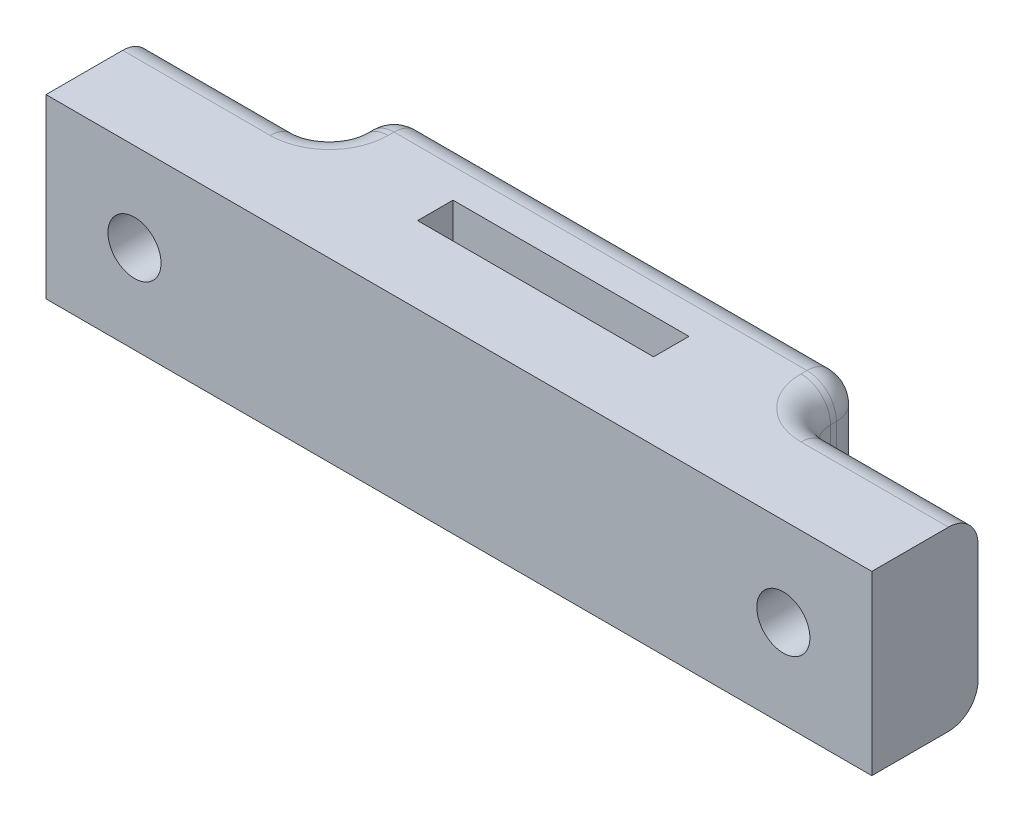
ISO-10303-21;
HEADER;
FILE_DESCRIPTION(('STEP AP214'),'2;1');
FILE_NAME('part.step','',(''),(''),'','','');
FILE_SCHEMA(('AUTOMOTIVE_DESIGN { 1 0 10303 214 1 1 1 1 }'));
ENDSEC;
DATA;
#1=APPLICATION_CONTEXT('core data for automotive mechanical design processes');
#2=APPLICATION_PROTOCOL_DEFINITION('international standard','automotive_design',2000,#1);
#3=PRODUCT_CONTEXT('',#1,'mechanical');
#4=PRODUCT('Part','Part','',(#3));
#5=PRODUCT_RELATED_PRODUCT_CATEGORY('part','',(#4));
#6=PRODUCT_DEFINITION_FORMATION('','',#4);
#7=PRODUCT_DEFINITION_CONTEXT('part definition',#1,'design');
#8=PRODUCT_DEFINITION('design','',#6,#7);
#9=PRODUCT_DEFINITION_SHAPE('','',#8);
#10=(LENGTH_UNIT() NAMED_UNIT(*) SI_UNIT(.MILLI.,.METRE.));
#11=(NAMED_UNIT(*) PLANE_ANGLE_UNIT() SI_UNIT($,.RADIAN.));
#12=(NAMED_UNIT(*) SI_UNIT($,.STERADIAN.) SOLID_ANGLE_UNIT());
#13=UNCERTAINTY_MEASURE_WITH_UNIT(LENGTH_MEASURE(1.E-05),#10,'distance_accuracy_value','');
#14=(GEOMETRIC_REPRESENTATION_CONTEXT(3) GLOBAL_UNCERTAINTY_ASSIGNED_CONTEXT((#13)) GLOBAL_UNIT_ASSIGNED_CONTEXT((#10,
#11,#12)) REPRESENTATION_CONTEXT('',''));
#15=CARTESIAN_POINT('',(0.,0.,0.));
#16=DIRECTION('',(0.,0.,1.));
#17=DIRECTION('',(1.,0.,0.));
#18=AXIS2_PLACEMENT_3D('',#15,#16,#17);
#19=CARTESIAN_POINT('',(20.,15.,-0.999999999999992));
#20=DIRECTION('',(0.,0.,1.));
#21=DIRECTION('',(1.,0.,0.));
#22=AXIS2_PLACEMENT_3D('',#19,#20,#21);
#23=PLANE('',#22);
#24=DIRECTION('',(0.,-1.,0.));
#25=VECTOR('',#24,1.);
#26=CARTESIAN_POINT('',(35.,15.,-0.999999999999992));
#27=LINE('',#26,#25);
#28=CARTESIAN_POINT('',(35.,12.5,-0.999999999999992));
#29=VERTEX_POINT('',#28);
#30=CARTESIAN_POINT('',(35.,2.5,-0.999999999999992));
#31=VERTEX_POINT('',#30);
#32=EDGE_CURVE('E252',#29,#31,#27,.T.);
#33=ORIENTED_EDGE('',*,*,#32,.T.);
#34=DIRECTION('',(-1.,0.,0.));
#35=VECTOR('',#34,1.);
#36=CARTESIAN_POINT('',(20.,2.5,-0.999999999999992));
#37=LINE('',#36,#35);
#38=CARTESIAN_POINT('',(22.5,2.5,-0.999999999999992));
#39=VERTEX_POINT('',#38);
#40=EDGE_CURVE('E325',#31,#39,#37,.T.);
#41=ORIENTED_EDGE('',*,*,#40,.T.);
#42=DIRECTION('',(0.,-1.,0.));
#43=VECTOR('',#42,1.);
#44=CARTESIAN_POINT('',(22.5,15.,-0.999999999999992));
#45=LINE('',#44,#43);
#46=CARTESIAN_POINT('',(22.5,12.5,-0.999999999999992));
#47=VERTEX_POINT('',#46);
#48=EDGE_CURVE('E321',#39,#47,#45,.F.);
#49=ORIENTED_EDGE('',*,*,#48,.T.);
#50=DIRECTION('',(-1.,0.,0.));
#51=VECTOR('',#50,1.);
#52=CARTESIAN_POINT('',(20.,12.5,-0.999999999999992));
#53=LINE('',#52,#51);
#54=EDGE_CURVE('E323',#47,#29,#53,.F.);
#55=ORIENTED_EDGE('',*,*,#54,.T.);
#56=EDGE_LOOP('',(#33,#41,#49,#55));
#57=FACE_BOUND('',#56,.T.);
#58=CARTESIAN_POINT('',(27.5,7.5,-0.999999999999992));
#59=DIRECTION('',(0.,0.,-1.));
#60=DIRECTION('',(-1.,0.,0.));
#61=AXIS2_PLACEMENT_3D('',#58,#59,#60);
#62=CIRCLE('',#61,4.);
#63=CARTESIAN_POINT('',(23.5,7.5,-0.999999999999992));
#64=VERTEX_POINT('',#63);
#65=EDGE_CURVE('E413',#64,#64,#62,.T.);
#66=ORIENTED_EDGE('',*,*,#65,.F.);
#67=EDGE_LOOP('',(#66));
#68=FACE_BOUND('',#67,.T.);
#69=ADVANCED_FACE('F35',(#57,#68),#23,.F.);
#70=CARTESIAN_POINT('',(-35.,15.,-0.999999999999992));
#71=DIRECTION('',(0.,0.,1.));
#72=DIRECTION('',(1.,0.,0.));
#73=AXIS2_PLACEMENT_3D('',#70,#71,#72);
#74=PLANE('',#73);
#75=DIRECTION('',(0.,-1.,0.));
#76=VECTOR('',#75,1.);
#77=CARTESIAN_POINT('',(-35.,15.,-0.999999999999992));
#78=LINE('',#77,#76);
#79=CARTESIAN_POINT('',(-35.,12.5,-0.999999999999992));
#80=VERTEX_POINT('',#79);
#81=CARTESIAN_POINT('',(-35.,2.5,-0.999999999999992));
#82=VERTEX_POINT('',#81);
#83=EDGE_CURVE('E266',#80,#82,#78,.T.);
#84=ORIENTED_EDGE('',*,*,#83,.F.);
#85=DIRECTION('',(-1.,0.,0.));
#86=VECTOR('',#85,1.);
#87=CARTESIAN_POINT('',(-35.,12.5,-0.999999999999992));
#88=LINE('',#87,#86);
#89=CARTESIAN_POINT('',(-22.5,12.5,-0.999999999999992));
#90=VERTEX_POINT('',#89);
#91=EDGE_CURVE('E294',#80,#90,#88,.F.);
#92=ORIENTED_EDGE('',*,*,#91,.T.);
#93=DIRECTION('',(0.,-1.,0.));
#94=VECTOR('',#93,1.);
#95=CARTESIAN_POINT('',(-22.5,0.,-0.999999999999992));
#96=LINE('',#95,#94);
#97=CARTESIAN_POINT('',(-22.5,2.5,-0.999999999999992));
#98=VERTEX_POINT('',#97);
#99=EDGE_CURVE('E290',#90,#98,#96,.T.);
#100=ORIENTED_EDGE('',*,*,#99,.T.);
#101=DIRECTION('',(-1.,0.,0.));
#102=VECTOR('',#101,1.);
#103=CARTESIAN_POINT('',(-35.,2.5,-0.999999999999992));
#104=LINE('',#103,#102);
#105=EDGE_CURVE('E292',#98,#82,#104,.T.);
#106=ORIENTED_EDGE('',*,*,#105,.T.);
#107=EDGE_LOOP('',(#84,#92,#100,#106));
#108=FACE_BOUND('',#107,.T.);
#109=CARTESIAN_POINT('',(-27.5,7.5,-0.999999999999992));
#110=DIRECTION('',(0.,0.,-1.));
#111=DIRECTION('',(-1.,0.,0.));
#112=AXIS2_PLACEMENT_3D('',#109,#110,#111);
#113=CIRCLE('',#112,3.99999999999999);
#114=CARTESIAN_POINT('',(-31.5,7.5,-0.999999999999992));
#115=VERTEX_POINT('',#114);
#116=EDGE_CURVE('E431',#115,#115,#113,.T.);
#117=ORIENTED_EDGE('',*,*,#116,.F.);
#118=EDGE_LOOP('',(#117));
#119=FACE_BOUND('',#118,.T.);
#120=ADVANCED_FACE('F465',(#108,#119),#74,.F.);
#121=CARTESIAN_POINT('',(0.,15.,0.));
#122=DIRECTION('',(0.,-1.,0.));
#123=DIRECTION('',(0.,0.,-1.));
#124=AXIS2_PLACEMENT_3D('',#121,#122,#123);
#125=PLANE('',#124);
#126=CARTESIAN_POINT('',(-22.5,15.,-3.49999999999999));
#127=DIRECTION('',(0.,-1.,0.));
#128=DIRECTION('',(0.,0.,-1.));
#129=AXIS2_PLACEMENT_3D('',#126,#127,#128);
#130=CIRCLE('',#129,5.);
#131=CARTESIAN_POINT('',(-22.5,15.,1.50000000000001));
#132=VERTEX_POINT('',#131);
#133=CARTESIAN_POINT('',(-17.5,15.,-3.49999999999999));
#134=VERTEX_POINT('',#133);
#135=EDGE_CURVE('E280',#132,#134,#130,.F.);
#136=ORIENTED_EDGE('',*,*,#135,.F.);
#137=DIRECTION('',(-1.,0.,0.));
#138=VECTOR('',#137,1.);
#139=CARTESIAN_POINT('',(0.,15.,1.50000000000001));
#140=LINE('',#139,#138);
#141=CARTESIAN_POINT('',(-35.,15.,1.50000000000001));
#142=VERTEX_POINT('',#141);
#143=EDGE_CURVE('E283',#132,#142,#140,.T.);
#144=ORIENTED_EDGE('',*,*,#143,.T.);
#145=DIRECTION('',(0.,0.,1.));
#146=VECTOR('',#145,1.);
#147=CARTESIAN_POINT('',(-35.,15.,8.00000000000001));
#148=LINE('',#147,#146);
#149=CARTESIAN_POINT('',(-35.,15.,8.00000000000001));
#150=VERTEX_POINT('',#149);
#151=EDGE_CURVE('E244',#142,#150,#148,.T.);
#152=ORIENTED_EDGE('',*,*,#151,.T.);
#153=DIRECTION('',(1.,0.,0.));
#154=VECTOR('',#153,1.);
#155=CARTESIAN_POINT('',(35.,15.,8.00000000000001));
#156=LINE('',#155,#154);
#157=CARTESIAN_POINT('',(35.,15.,8.00000000000001));
#158=VERTEX_POINT('',#157);
#159=EDGE_CURVE('E246',#150,#158,#156,.T.);
#160=ORIENTED_EDGE('',*,*,#159,.T.);
#161=DIRECTION('',(0.,0.,-1.));
#162=VECTOR('',#161,1.);
#163=CARTESIAN_POINT('',(35.,15.,-0.999999999999992));
#164=LINE('',#163,#162);
#165=CARTESIAN_POINT('',(35.,15.,1.50000000000001));
#166=VERTEX_POINT('',#165);
#167=EDGE_CURVE('E249',#158,#166,#164,.T.);
#168=ORIENTED_EDGE('',*,*,#167,.T.);
#169=DIRECTION('',(-1.,0.,0.));
#170=VECTOR('',#169,1.);
#171=CARTESIAN_POINT('',(0.,15.,1.50000000000001));
#172=LINE('',#171,#170);
#173=CARTESIAN_POINT('',(22.5,15.,1.50000000000001));
#174=VERTEX_POINT('',#173);
#175=EDGE_CURVE('E278',#166,#174,#172,.T.);
#176=ORIENTED_EDGE('',*,*,#175,.T.);
#177=CARTESIAN_POINT('',(22.5,15.,-3.49999999999999));
#178=DIRECTION('',(0.,-1.,0.));
#179=DIRECTION('',(0.,0.,-1.));
#180=AXIS2_PLACEMENT_3D('',#177,#178,#179);
#181=CIRCLE('',#180,5.);
#182=CARTESIAN_POINT('',(17.5,15.,-3.49999999999999));
#183=VERTEX_POINT('',#182);
#184=EDGE_CURVE('E275',#183,#174,#181,.F.);
#185=ORIENTED_EDGE('',*,*,#184,.F.);
#186=DIRECTION('',(0.,0.,-1.));
#187=VECTOR('',#186,1.);
#188=CARTESIAN_POINT('',(17.5,15.,0.));
#189=LINE('',#188,#187);
#190=CARTESIAN_POINT('',(17.5,15.,-4.));
#191=VERTEX_POINT('',#190);
#192=EDGE_CURVE('E273',#183,#191,#189,.T.);
#193=ORIENTED_EDGE('',*,*,#192,.T.);
#194=DIRECTION('',(-1.,0.,0.));
#195=VECTOR('',#194,1.);
#196=CARTESIAN_POINT('',(0.,15.,-4.));
#197=LINE('',#196,#195);
#198=CARTESIAN_POINT('',(-17.5,15.,-4.));
#199=VERTEX_POINT('',#198);
#200=EDGE_CURVE('E269',#191,#199,#197,.T.);
#201=ORIENTED_EDGE('',*,*,#200,.T.);
#202=DIRECTION('',(0.,0.,1.));
#203=VECTOR('',#202,1.);
#204=CARTESIAN_POINT('',(-17.5,15.,0.));
#205=LINE('',#204,#203);
#206=EDGE_CURVE('E271',#199,#134,#205,.T.);
#207=ORIENTED_EDGE('',*,*,#206,.T.);
#208=EDGE_LOOP('',(#136,#144,#152,#160,#168,#176,#185,#193,#201,#207));
#209=FACE_BOUND('',#208,.T.);
#210=DIRECTION('',(0.,0.,-1.));
#211=VECTOR('',#210,1.);
#212=CARTESIAN_POINT('',(10.,15.,-1.5));
#213=LINE('',#212,#211);
#214=CARTESIAN_POINT('',(10.,15.,1.5));
#215=VERTEX_POINT('',#214);
#216=CARTESIAN_POINT('',(10.,15.,-1.5));
#217=VERTEX_POINT('',#216);
#218=EDGE_CURVE('E200',#215,#217,#213,.T.);
#219=ORIENTED_EDGE('',*,*,#218,.F.);
#220=DIRECTION('',(1.,0.,0.));
#221=VECTOR('',#220,1.);
#222=CARTESIAN_POINT('',(-10.,15.,1.5));
#223=LINE('',#222,#221);
#224=CARTESIAN_POINT('',(-10.,15.,1.5));
#225=VERTEX_POINT('',#224);
#226=EDGE_CURVE('E226',#225,#215,#223,.T.);
#227=ORIENTED_EDGE('',*,*,#226,.F.);
#228=DIRECTION('',(0.,0.,1.));
#229=VECTOR('',#228,1.);
#230=CARTESIAN_POINT('',(-10.,15.,-1.5));
#231=LINE('',#230,#229);
#232=CARTESIAN_POINT('',(-10.,15.,-1.5));
#233=VERTEX_POINT('',#232);
#234=EDGE_CURVE('E224',#233,#225,#231,.T.);
#235=ORIENTED_EDGE('',*,*,#234,.F.);
#236=DIRECTION('',(-1.,0.,0.));
#237=VECTOR('',#236,1.);
#238=CARTESIAN_POINT('',(-10.,15.,-1.5));
#239=LINE('',#238,#237);
#240=EDGE_CURVE('E210',#217,#233,#239,.T.);
#241=ORIENTED_EDGE('',*,*,#240,.F.);
#242=EDGE_LOOP('',(#219,#227,#235,#241));
#243=FACE_BOUND('',#242,.T.);
#244=ADVANCED_FACE('F222',(#209,#243),#125,.F.);
#245=CARTESIAN_POINT('',(0.,0.,0.));
#246=DIRECTION('',(0.,-1.,0.));
#247=DIRECTION('',(0.,0.,-1.));
#248=AXIS2_PLACEMENT_3D('',#245,#246,#247);
#249=PLANE('',#248);
#250=DIRECTION('',(0.,0.,1.));
#251=VECTOR('',#250,1.);
#252=CARTESIAN_POINT('',(-35.,0.,8.00000000000001));
#253=LINE('',#252,#251);
#254=CARTESIAN_POINT('',(-35.,0.,1.50000000000001));
#255=VERTEX_POINT('',#254);
#256=CARTESIAN_POINT('',(-35.,0.,8.00000000000001));
#257=VERTEX_POINT('',#256);
#258=EDGE_CURVE('E218',#255,#257,#253,.T.);
#259=ORIENTED_EDGE('',*,*,#258,.F.);
#260=DIRECTION('',(-1.,0.,0.));
#261=VECTOR('',#260,1.);
#262=CARTESIAN_POINT('',(-20.,0.,1.50000000000001));
#263=LINE('',#262,#261);
#264=CARTESIAN_POINT('',(-22.5,0.,1.50000000000001));
#265=VERTEX_POINT('',#264);
#266=EDGE_CURVE('E310',#255,#265,#263,.F.);
#267=ORIENTED_EDGE('',*,*,#266,.T.);
#268=CARTESIAN_POINT('',(-22.5,0.,-3.49999999999999));
#269=DIRECTION('',(0.,-1.,0.));
#270=DIRECTION('',(0.,0.,-1.));
#271=AXIS2_PLACEMENT_3D('',#268,#269,#270);
#272=CIRCLE('',#271,5.);
#273=CARTESIAN_POINT('',(-17.5,0.,-3.49999999999999));
#274=VERTEX_POINT('',#273);
#275=EDGE_CURVE('E307',#274,#265,#272,.T.);
#276=ORIENTED_EDGE('',*,*,#275,.F.);
#277=DIRECTION('',(0.,0.,1.));
#278=VECTOR('',#277,1.);
#279=CARTESIAN_POINT('',(-17.5,0.,-6.5));
#280=LINE('',#279,#278);
#281=CARTESIAN_POINT('',(-17.5,0.,-4.));
#282=VERTEX_POINT('',#281);
#283=EDGE_CURVE('E303',#274,#282,#280,.F.);
#284=ORIENTED_EDGE('',*,*,#283,.T.);
#285=DIRECTION('',(-1.,0.,0.));
#286=VECTOR('',#285,1.);
#287=CARTESIAN_POINT('',(20.,0.,-4.));
#288=LINE('',#287,#286);
#289=CARTESIAN_POINT('',(17.5,0.,-4.));
#290=VERTEX_POINT('',#289);
#291=EDGE_CURVE('E301',#282,#290,#288,.F.);
#292=ORIENTED_EDGE('',*,*,#291,.T.);
#293=DIRECTION('',(0.,0.,-1.));
#294=VECTOR('',#293,1.);
#295=CARTESIAN_POINT('',(17.5,0.,-0.999999999999992));
#296=LINE('',#295,#294);
#297=CARTESIAN_POINT('',(17.5,0.,-3.49999999999999));
#298=VERTEX_POINT('',#297);
#299=EDGE_CURVE('E299',#290,#298,#296,.F.);
#300=ORIENTED_EDGE('',*,*,#299,.T.);
#301=CARTESIAN_POINT('',(22.5,0.,-3.49999999999999));
#302=DIRECTION('',(0.,-1.,0.));
#303=DIRECTION('',(0.,0.,-1.));
#304=AXIS2_PLACEMENT_3D('',#301,#302,#303);
#305=CIRCLE('',#304,5.);
#306=CARTESIAN_POINT('',(22.5,0.,1.50000000000001));
#307=VERTEX_POINT('',#306);
#308=EDGE_CURVE('E296',#307,#298,#305,.T.);
#309=ORIENTED_EDGE('',*,*,#308,.F.);
#310=DIRECTION('',(-1.,0.,0.));
#311=VECTOR('',#310,1.);
#312=CARTESIAN_POINT('',(35.,0.,1.50000000000001));
#313=LINE('',#312,#311);
#314=CARTESIAN_POINT('',(35.,0.,1.50000000000001));
#315=VERTEX_POINT('',#314);
#316=EDGE_CURVE('E305',#307,#315,#313,.F.);
#317=ORIENTED_EDGE('',*,*,#316,.T.);
#318=DIRECTION('',(0.,0.,-1.));
#319=VECTOR('',#318,1.);
#320=CARTESIAN_POINT('',(35.,0.,-0.999999999999992));
#321=LINE('',#320,#319);
#322=CARTESIAN_POINT('',(35.,0.,8.00000000000001));
#323=VERTEX_POINT('',#322);
#324=EDGE_CURVE('E247',#323,#315,#321,.T.);
#325=ORIENTED_EDGE('',*,*,#324,.F.);
#326=DIRECTION('',(1.,0.,0.));
#327=VECTOR('',#326,1.);
#328=CARTESIAN_POINT('',(35.,0.,8.00000000000001));
#329=LINE('',#328,#327);
#330=EDGE_CURVE('E254',#257,#323,#329,.T.);
#331=ORIENTED_EDGE('',*,*,#330,.F.);
#332=EDGE_LOOP('',(#259,#267,#276,#284,#292,#300,#309,#317,#325,#331));
#333=FACE_BOUND('',#332,.T.);
#334=DIRECTION('',(1.,0.,0.));
#335=VECTOR('',#334,1.);
#336=CARTESIAN_POINT('',(-10.,0.,1.5));
#337=LINE('',#336,#335);
#338=CARTESIAN_POINT('',(-10.,0.,1.5));
#339=VERTEX_POINT('',#338);
#340=CARTESIAN_POINT('',(10.,0.,1.5));
#341=VERTEX_POINT('',#340);
#342=EDGE_CURVE('E211',#339,#341,#337,.T.);
#343=ORIENTED_EDGE('',*,*,#342,.T.);
#344=DIRECTION('',(0.,0.,-1.));
#345=VECTOR('',#344,1.);
#346=CARTESIAN_POINT('',(10.,0.,-1.5));
#347=LINE('',#346,#345);
#348=CARTESIAN_POINT('',(10.,0.,-1.5));
#349=VERTEX_POINT('',#348);
#350=EDGE_CURVE('E231',#341,#349,#347,.T.);
#351=ORIENTED_EDGE('',*,*,#350,.T.);
#352=DIRECTION('',(-1.,0.,0.));
#353=VECTOR('',#352,1.);
#354=CARTESIAN_POINT('',(-10.,0.,-1.5));
#355=LINE('',#354,#353);
#356=CARTESIAN_POINT('',(-10.,0.,-1.5));
#357=VERTEX_POINT('',#356);
#358=EDGE_CURVE('E217',#349,#357,#355,.T.);
#359=ORIENTED_EDGE('',*,*,#358,.T.);
#360=DIRECTION('',(0.,0.,1.));
#361=VECTOR('',#360,1.);
#362=CARTESIAN_POINT('',(-10.,0.,-1.5));
#363=LINE('',#362,#361);
#364=EDGE_CURVE('E235',#357,#339,#363,.T.);
#365=ORIENTED_EDGE('',*,*,#364,.T.);
#366=EDGE_LOOP('',(#343,#351,#359,#365));
#367=FACE_BOUND('',#366,.T.);
#368=ADVANCED_FACE('F473',(#333,#367),#249,.T.);
#369=CARTESIAN_POINT('',(-20.,15.,-0.999999999999992));
#370=DIRECTION('',(1.,0.,0.));
#371=DIRECTION('',(0.,0.,-1.));
#372=AXIS2_PLACEMENT_3D('',#369,#370,#371);
#373=PLANE('',#372);
#374=DIRECTION('',(0.,0.,1.));
#375=VECTOR('',#374,1.);
#376=CARTESIAN_POINT('',(-20.,12.5,-0.999999999999992));
#377=LINE('',#376,#375);
#378=CARTESIAN_POINT('',(-20.,12.5,-3.49999999999999));
#379=VERTEX_POINT('',#378);
#380=CARTESIAN_POINT('',(-20.,12.5,-4.));
#381=VERTEX_POINT('',#380);
#382=EDGE_CURVE('E335',#379,#381,#377,.F.);
#383=ORIENTED_EDGE('',*,*,#382,.T.);
#384=DIRECTION('',(0.,-1.,0.));
#385=VECTOR('',#384,1.);
#386=CARTESIAN_POINT('',(-20.,15.,-4.));
#387=LINE('',#386,#385);
#388=CARTESIAN_POINT('',(-20.,2.5,-4.));
#389=VERTEX_POINT('',#388);
#390=EDGE_CURVE('E337',#381,#389,#387,.T.);
#391=ORIENTED_EDGE('',*,*,#390,.T.);
#392=DIRECTION('',(0.,0.,1.));
#393=VECTOR('',#392,1.);
#394=CARTESIAN_POINT('',(-20.,2.5,-0.999999999999992));
#395=LINE('',#394,#393);
#396=CARTESIAN_POINT('',(-20.,2.5,-3.49999999999999));
#397=VERTEX_POINT('',#396);
#398=EDGE_CURVE('E331',#389,#397,#395,.T.);
#399=ORIENTED_EDGE('',*,*,#398,.T.);
#400=DIRECTION('',(0.,-1.,0.));
#401=VECTOR('',#400,1.);
#402=CARTESIAN_POINT('',(-20.,15.,-3.49999999999999));
#403=LINE('',#402,#401);
#404=EDGE_CURVE('E333',#397,#379,#403,.F.);
#405=ORIENTED_EDGE('',*,*,#404,.T.);
#406=EDGE_LOOP('',(#383,#391,#399,#405));
#407=FACE_BOUND('',#406,.T.);
#408=ADVANCED_FACE('F483',(#407),#373,.F.);
#409=CARTESIAN_POINT('',(-35.,15.,8.00000000000001));
#410=DIRECTION('',(1.,0.,0.));
#411=DIRECTION('',(0.,0.,-1.));
#412=AXIS2_PLACEMENT_3D('',#409,#410,#411);
#413=PLANE('',#412);
#414=ORIENTED_EDGE('',*,*,#151,.F.);
#415=CARTESIAN_POINT('',(-35.,12.5,1.50000000000001));
#416=DIRECTION('',(1.,0.,0.));
#417=DIRECTION('',(0.,0.,-1.));
#418=AXIS2_PLACEMENT_3D('',#415,#416,#417);
#419=CIRCLE('',#418,2.5);
#420=EDGE_CURVE('E288',#142,#80,#419,.F.);
#421=ORIENTED_EDGE('',*,*,#420,.T.);
#422=ORIENTED_EDGE('',*,*,#83,.T.);
#423=CARTESIAN_POINT('',(-35.,2.5,1.50000000000001));
#424=DIRECTION('',(1.,0.,0.));
#425=DIRECTION('',(0.,0.,-1.));
#426=AXIS2_PLACEMENT_3D('',#423,#424,#425);
#427=CIRCLE('',#426,2.5);
#428=EDGE_CURVE('E286',#82,#255,#427,.F.);
#429=ORIENTED_EDGE('',*,*,#428,.T.);
#430=ORIENTED_EDGE('',*,*,#258,.T.);
#431=DIRECTION('',(0.,-1.,0.));
#432=VECTOR('',#431,1.);
#433=CARTESIAN_POINT('',(-35.,15.,8.00000000000001));
#434=LINE('',#433,#432);
#435=EDGE_CURVE('E263',#150,#257,#434,.T.);
#436=ORIENTED_EDGE('',*,*,#435,.F.);
#437=EDGE_LOOP('',(#414,#421,#422,#429,#430,#436));
#438=FACE_BOUND('',#437,.T.);
#439=ADVANCED_FACE('F481',(#438),#413,.F.);
#440=CARTESIAN_POINT('',(35.,15.,8.00000000000001));
#441=DIRECTION('',(0.,0.,-1.));
#442=DIRECTION('',(-1.,0.,0.));
#443=AXIS2_PLACEMENT_3D('',#440,#441,#442);
#444=PLANE('',#443);
#445=CARTESIAN_POINT('',(27.5,7.5,8.00000000000001));
#446=DIRECTION('',(0.,0.,-1.));
#447=DIRECTION('',(-1.,0.,0.));
#448=AXIS2_PLACEMENT_3D('',#445,#446,#447);
#449=CIRCLE('',#448,2.25000000000001);
#450=CARTESIAN_POINT('',(25.25,7.5,8.00000000000001));
#451=VERTEX_POINT('',#450);
#452=EDGE_CURVE('E428',#451,#451,#449,.T.);
#453=ORIENTED_EDGE('',*,*,#452,.T.);
#454=EDGE_LOOP('',(#453));
#455=FACE_BOUND('',#454,.T.);
#456=CARTESIAN_POINT('',(-27.5,7.5,8.00000000000001));
#457=DIRECTION('',(0.,0.,-1.));
#458=DIRECTION('',(-1.,0.,0.));
#459=AXIS2_PLACEMENT_3D('',#456,#457,#458);
#460=CIRCLE('',#459,2.25000000000001);
#461=CARTESIAN_POINT('',(-29.75,7.5,8.00000000000001));
#462=VERTEX_POINT('',#461);
#463=EDGE_CURVE('E233',#462,#462,#460,.T.);
#464=ORIENTED_EDGE('',*,*,#463,.T.);
#465=EDGE_LOOP('',(#464));
#466=FACE_BOUND('',#465,.T.);
#467=ORIENTED_EDGE('',*,*,#330,.T.);
#468=DIRECTION('',(0.,-1.,0.));
#469=VECTOR('',#468,1.);
#470=CARTESIAN_POINT('',(35.,15.,8.00000000000001));
#471=LINE('',#470,#469);
#472=EDGE_CURVE('E260',#158,#323,#471,.T.);
#473=ORIENTED_EDGE('',*,*,#472,.F.);
#474=ORIENTED_EDGE('',*,*,#159,.F.);
#475=ORIENTED_EDGE('',*,*,#435,.T.);
#476=EDGE_LOOP('',(#467,#473,#474,#475));
#477=FACE_BOUND('',#476,.T.);
#478=ADVANCED_FACE('F442',(#455,#466,#477),#444,.F.);
#479=CARTESIAN_POINT('',(35.,15.,-0.999999999999992));
#480=DIRECTION('',(-1.,0.,0.));
#481=DIRECTION('',(0.,0.,1.));
#482=AXIS2_PLACEMENT_3D('',#479,#480,#481);
#483=PLANE('',#482);
#484=ORIENTED_EDGE('',*,*,#324,.T.);
#485=CARTESIAN_POINT('',(35.,2.5,1.50000000000001));
#486=DIRECTION('',(-1.,0.,0.));
#487=DIRECTION('',(0.,0.,1.));
#488=AXIS2_PLACEMENT_3D('',#485,#486,#487);
#489=CIRCLE('',#488,2.5);
#490=EDGE_CURVE('E329',#315,#31,#489,.F.);
#491=ORIENTED_EDGE('',*,*,#490,.T.);
#492=ORIENTED_EDGE('',*,*,#32,.F.);
#493=CARTESIAN_POINT('',(35.,12.5,1.50000000000001));
#494=DIRECTION('',(-1.,0.,0.));
#495=DIRECTION('',(0.,0.,1.));
#496=AXIS2_PLACEMENT_3D('',#493,#494,#495);
#497=CIRCLE('',#496,2.5);
#498=EDGE_CURVE('E327',#29,#166,#497,.F.);
#499=ORIENTED_EDGE('',*,*,#498,.T.);
#500=ORIENTED_EDGE('',*,*,#167,.F.);
#501=ORIENTED_EDGE('',*,*,#472,.T.);
#502=EDGE_LOOP('',(#484,#491,#492,#499,#500,#501));
#503=FACE_BOUND('',#502,.T.);
#504=ADVANCED_FACE('F582',(#503),#483,.F.);
#505=CARTESIAN_POINT('',(20.,15.,-6.5));
#506=DIRECTION('',(-1.,0.,0.));
#507=DIRECTION('',(0.,0.,1.));
#508=AXIS2_PLACEMENT_3D('',#505,#506,#507);
#509=PLANE('',#508);
#510=DIRECTION('',(0.,-1.,0.));
#511=VECTOR('',#510,1.);
#512=CARTESIAN_POINT('',(20.,15.,-4.));
#513=LINE('',#512,#511);
#514=CARTESIAN_POINT('',(20.,2.5,-4.));
#515=VERTEX_POINT('',#514);
#516=CARTESIAN_POINT('',(20.,12.5,-4.));
#517=VERTEX_POINT('',#516);
#518=EDGE_CURVE('E316',#515,#517,#513,.F.);
#519=ORIENTED_EDGE('',*,*,#518,.T.);
#520=DIRECTION('',(0.,0.,-1.));
#521=VECTOR('',#520,1.);
#522=CARTESIAN_POINT('',(20.,12.5,-6.5));
#523=LINE('',#522,#521);
#524=CARTESIAN_POINT('',(20.,12.5,-3.49999999999999));
#525=VERTEX_POINT('',#524);
#526=EDGE_CURVE('E318',#517,#525,#523,.F.);
#527=ORIENTED_EDGE('',*,*,#526,.T.);
#528=DIRECTION('',(0.,-1.,0.));
#529=VECTOR('',#528,1.);
#530=CARTESIAN_POINT('',(20.,0.,-3.49999999999999));
#531=LINE('',#530,#529);
#532=CARTESIAN_POINT('',(20.,2.5,-3.49999999999999));
#533=VERTEX_POINT('',#532);
#534=EDGE_CURVE('E314',#525,#533,#531,.T.);
#535=ORIENTED_EDGE('',*,*,#534,.T.);
#536=DIRECTION('',(0.,0.,-1.));
#537=VECTOR('',#536,1.);
#538=CARTESIAN_POINT('',(20.,2.5,-6.5));
#539=LINE('',#538,#537);
#540=EDGE_CURVE('E312',#533,#515,#539,.T.);
#541=ORIENTED_EDGE('',*,*,#540,.T.);
#542=EDGE_LOOP('',(#519,#527,#535,#541));
#543=FACE_BOUND('',#542,.T.);
#544=ADVANCED_FACE('F605',(#543),#509,.F.);
#545=CARTESIAN_POINT('',(-20.,15.,-6.5));
#546=DIRECTION('',(0.,0.,1.));
#547=DIRECTION('',(1.,0.,0.));
#548=AXIS2_PLACEMENT_3D('',#545,#546,#547);
#549=PLANE('',#548);
#550=DIRECTION('',(-1.,0.,0.));
#551=VECTOR('',#550,1.);
#552=CARTESIAN_POINT('',(-20.,2.5,-6.5));
#553=LINE('',#552,#551);
#554=CARTESIAN_POINT('',(17.5,2.5,-6.5));
#555=VERTEX_POINT('',#554);
#556=CARTESIAN_POINT('',(-17.5,2.5,-6.5));
#557=VERTEX_POINT('',#556);
#558=EDGE_CURVE('E44',#555,#557,#553,.T.);
#559=ORIENTED_EDGE('',*,*,#558,.T.);
#560=DIRECTION('',(0.,-1.,0.));
#561=VECTOR('',#560,1.);
#562=CARTESIAN_POINT('',(-17.5,15.,-6.5));
#563=LINE('',#562,#561);
#564=CARTESIAN_POINT('',(-17.5,12.5,-6.5));
#565=VERTEX_POINT('',#564);
#566=EDGE_CURVE('E11',#557,#565,#563,.F.);
#567=ORIENTED_EDGE('',*,*,#566,.T.);
#568=DIRECTION('',(-1.,0.,0.));
#569=VECTOR('',#568,1.);
#570=CARTESIAN_POINT('',(-20.,12.5,-6.5));
#571=LINE('',#570,#569);
#572=CARTESIAN_POINT('',(17.5,12.5,-6.5));
#573=VERTEX_POINT('',#572);
#574=EDGE_CURVE('E342',#565,#573,#571,.F.);
#575=ORIENTED_EDGE('',*,*,#574,.T.);
#576=DIRECTION('',(0.,-1.,0.));
#577=VECTOR('',#576,1.);
#578=CARTESIAN_POINT('',(17.5,15.,-6.5));
#579=LINE('',#578,#577);
#580=EDGE_CURVE('E340',#573,#555,#579,.T.);
#581=ORIENTED_EDGE('',*,*,#580,.T.);
#582=EDGE_LOOP('',(#559,#567,#575,#581));
#583=FACE_BOUND('',#582,.T.);
#584=ADVANCED_FACE('F633',(#583),#549,.F.);
#585=CARTESIAN_POINT('',(10.,15.,-1.5));
#586=DIRECTION('',(-1.,0.,0.));
#587=DIRECTION('',(0.,0.,1.));
#588=AXIS2_PLACEMENT_3D('',#585,#586,#587);
#589=PLANE('',#588);
#590=ORIENTED_EDGE('',*,*,#350,.F.);
#591=DIRECTION('',(0.,-1.,0.));
#592=VECTOR('',#591,1.);
#593=CARTESIAN_POINT('',(10.,15.,1.5));
#594=LINE('',#593,#592);
#595=EDGE_CURVE('E206',#215,#341,#594,.T.);
#596=ORIENTED_EDGE('',*,*,#595,.F.);
#597=ORIENTED_EDGE('',*,*,#218,.T.);
#598=DIRECTION('',(0.,-1.,0.));
#599=VECTOR('',#598,1.);
#600=CARTESIAN_POINT('',(10.,15.,-1.5));
#601=LINE('',#600,#599);
#602=EDGE_CURVE('E203',#217,#349,#601,.T.);
#603=ORIENTED_EDGE('',*,*,#602,.T.);
#604=EDGE_LOOP('',(#590,#596,#597,#603));
#605=FACE_BOUND('',#604,.T.);
#606=ADVANCED_FACE('F202',(#605),#589,.T.);
#607=CARTESIAN_POINT('',(-10.,15.,-1.5));
#608=DIRECTION('',(0.,0.,1.));
#609=DIRECTION('',(1.,0.,0.));
#610=AXIS2_PLACEMENT_3D('',#607,#608,#609);
#611=PLANE('',#610);
#612=ORIENTED_EDGE('',*,*,#358,.F.);
#613=ORIENTED_EDGE('',*,*,#602,.F.);
#614=ORIENTED_EDGE('',*,*,#240,.T.);
#615=DIRECTION('',(0.,-1.,0.));
#616=VECTOR('',#615,1.);
#617=CARTESIAN_POINT('',(-10.,15.,-1.5));
#618=LINE('',#617,#616);
#619=EDGE_CURVE('E219',#233,#357,#618,.T.);
#620=ORIENTED_EDGE('',*,*,#619,.T.);
#621=EDGE_LOOP('',(#612,#613,#614,#620));
#622=FACE_BOUND('',#621,.T.);
#623=ADVANCED_FACE('F214',(#622),#611,.T.);
#624=CARTESIAN_POINT('',(-10.,15.,-1.5));
#625=DIRECTION('',(1.,0.,0.));
#626=DIRECTION('',(0.,0.,-1.));
#627=AXIS2_PLACEMENT_3D('',#624,#625,#626);
#628=PLANE('',#627);
#629=ORIENTED_EDGE('',*,*,#364,.F.);
#630=ORIENTED_EDGE('',*,*,#619,.F.);
#631=ORIENTED_EDGE('',*,*,#234,.T.);
#632=DIRECTION('',(0.,-1.,0.));
#633=VECTOR('',#632,1.);
#634=CARTESIAN_POINT('',(-10.,15.,1.5));
#635=LINE('',#634,#633);
#636=EDGE_CURVE('E241',#225,#339,#635,.T.);
#637=ORIENTED_EDGE('',*,*,#636,.T.);
#638=EDGE_LOOP('',(#629,#630,#631,#637));
#639=FACE_BOUND('',#638,.T.);
#640=ADVANCED_FACE('F642',(#639),#628,.T.);
#641=CARTESIAN_POINT('',(-10.,15.,1.5));
#642=DIRECTION('',(0.,0.,-1.));
#643=DIRECTION('',(-1.,0.,0.));
#644=AXIS2_PLACEMENT_3D('',#641,#642,#643);
#645=PLANE('',#644);
#646=ORIENTED_EDGE('',*,*,#342,.F.);
#647=ORIENTED_EDGE('',*,*,#636,.F.);
#648=ORIENTED_EDGE('',*,*,#226,.T.);
#649=ORIENTED_EDGE('',*,*,#595,.T.);
#650=EDGE_LOOP('',(#646,#647,#648,#649));
#651=FACE_BOUND('',#650,.T.);
#652=ADVANCED_FACE('F449',(#651),#645,.T.);
#653=CARTESIAN_POINT('',(-27.5,7.5,-0.999999999999992));
#654=DIRECTION('',(0.,0.,-1.));
#655=DIRECTION('',(-1.,0.,0.));
#656=AXIS2_PLACEMENT_3D('',#653,#654,#655);
#657=CYLINDRICAL_SURFACE('',#656,2.25000000000001);
#658=ORIENTED_EDGE('',*,*,#463,.F.);
#659=EDGE_LOOP('',(#658));
#660=FACE_BOUND('',#659,.T.);
#661=CARTESIAN_POINT('',(-27.5,7.5,3.40000000000001));
#662=DIRECTION('',(0.,0.,-1.));
#663=DIRECTION('',(-1.,0.,0.));
#664=AXIS2_PLACEMENT_3D('',#661,#662,#663);
#665=CIRCLE('',#664,2.25000000000001);
#666=CARTESIAN_POINT('',(-29.75,7.5,3.40000000000001));
#667=VERTEX_POINT('',#666);
#668=EDGE_CURVE('E437',#667,#667,#665,.T.);
#669=ORIENTED_EDGE('',*,*,#668,.T.);
#670=EDGE_LOOP('',(#669));
#671=FACE_BOUND('',#670,.T.);
#672=ADVANCED_FACE('F445',(#660,#671),#657,.F.);
#673=CARTESIAN_POINT('',(-25.25,7.5,3.40000000000001));
#674=DIRECTION('',(0.,0.,1.));
#675=DIRECTION('',(1.,0.,0.));
#676=AXIS2_PLACEMENT_3D('',#673,#674,#675);
#677=PLANE('',#676);
#678=ORIENTED_EDGE('',*,*,#668,.F.);
#679=EDGE_LOOP('',(#678));
#680=FACE_BOUND('',#679,.T.);
#681=CARTESIAN_POINT('',(-27.5,7.5,3.40000000000001));
#682=DIRECTION('',(0.,0.,-1.));
#683=DIRECTION('',(-1.,0.,0.));
#684=AXIS2_PLACEMENT_3D('',#681,#682,#683);
#685=CIRCLE('',#684,3.99999999999999);
#686=CARTESIAN_POINT('',(-31.5,7.5,3.40000000000001));
#687=VERTEX_POINT('',#686);
#688=EDGE_CURVE('E434',#687,#687,#685,.T.);
#689=ORIENTED_EDGE('',*,*,#688,.T.);
#690=EDGE_LOOP('',(#689));
#691=FACE_BOUND('',#690,.T.);
#692=ADVANCED_FACE('F448',(#680,#691),#677,.F.);
#693=CARTESIAN_POINT('',(-27.5,7.5,-0.999999999999992));
#694=DIRECTION('',(0.,0.,-1.));
#695=DIRECTION('',(-1.,0.,0.));
#696=AXIS2_PLACEMENT_3D('',#693,#694,#695);
#697=CYLINDRICAL_SURFACE('',#696,3.99999999999999);
#698=ORIENTED_EDGE('',*,*,#688,.F.);
#699=EDGE_LOOP('',(#698));
#700=FACE_BOUND('',#699,.T.);
#701=ORIENTED_EDGE('',*,*,#116,.T.);
#702=EDGE_LOOP('',(#701));
#703=FACE_BOUND('',#702,.T.);
#704=ADVANCED_FACE('F455',(#700,#703),#697,.F.);
#705=CARTESIAN_POINT('',(27.5,7.5,-0.999999999999992));
#706=DIRECTION('',(0.,0.,-1.));
#707=DIRECTION('',(-1.,0.,0.));
#708=AXIS2_PLACEMENT_3D('',#705,#706,#707);
#709=CYLINDRICAL_SURFACE('',#708,2.25000000000001);
#710=ORIENTED_EDGE('',*,*,#452,.F.);
#711=EDGE_LOOP('',(#710));
#712=FACE_BOUND('',#711,.T.);
#713=CARTESIAN_POINT('',(27.5,7.5,3.40000000000001));
#714=DIRECTION('',(0.,0.,-1.));
#715=DIRECTION('',(-1.,0.,0.));
#716=AXIS2_PLACEMENT_3D('',#713,#714,#715);
#717=CIRCLE('',#716,2.25000000000001);
#718=CARTESIAN_POINT('',(25.25,7.5,3.40000000000001));
#719=VERTEX_POINT('',#718);
#720=EDGE_CURVE('E423',#719,#719,#717,.T.);
#721=ORIENTED_EDGE('',*,*,#720,.T.);
#722=EDGE_LOOP('',(#721));
#723=FACE_BOUND('',#722,.T.);
#724=ADVANCED_FACE('F461',(#712,#723),#709,.F.);
#725=CARTESIAN_POINT('',(29.75,7.5,3.40000000000001));
#726=DIRECTION('',(0.,0.,1.));
#727=DIRECTION('',(1.,0.,0.));
#728=AXIS2_PLACEMENT_3D('',#725,#726,#727);
#729=PLANE('',#728);
#730=ORIENTED_EDGE('',*,*,#720,.F.);
#731=EDGE_LOOP('',(#730));
#732=FACE_BOUND('',#731,.T.);
#733=CARTESIAN_POINT('',(27.5,7.5,3.40000000000001));
#734=DIRECTION('',(0.,0.,-1.));
#735=DIRECTION('',(-1.,0.,0.));
#736=AXIS2_PLACEMENT_3D('',#733,#734,#735);
#737=CIRCLE('',#736,4.);
#738=CARTESIAN_POINT('',(23.5,7.5,3.40000000000001));
#739=VERTEX_POINT('',#738);
#740=EDGE_CURVE('E418',#739,#739,#737,.T.);
#741=ORIENTED_EDGE('',*,*,#740,.T.);
#742=EDGE_LOOP('',(#741));
#743=FACE_BOUND('',#742,.T.);
#744=ADVANCED_FACE('F574',(#732,#743),#729,.F.);
#745=CARTESIAN_POINT('',(27.5,7.5,-0.999999999999992));
#746=DIRECTION('',(0.,0.,-1.));
#747=DIRECTION('',(-1.,0.,0.));
#748=AXIS2_PLACEMENT_3D('',#745,#746,#747);
#749=CYLINDRICAL_SURFACE('',#748,4.);
#750=ORIENTED_EDGE('',*,*,#740,.F.);
#751=EDGE_LOOP('',(#750));
#752=FACE_BOUND('',#751,.T.);
#753=ORIENTED_EDGE('',*,*,#65,.T.);
#754=EDGE_LOOP('',(#753));
#755=FACE_BOUND('',#754,.T.);
#756=ADVANCED_FACE('F569',(#752,#755),#749,.F.);
#757=CARTESIAN_POINT('',(20.,2.5,1.50000000000001));
#758=DIRECTION('',(1.,0.,0.));
#759=DIRECTION('',(0.,0.,-1.));
#760=AXIS2_PLACEMENT_3D('',#757,#758,#759);
#761=CYLINDRICAL_SURFACE('',#760,2.5);
#762=ORIENTED_EDGE('',*,*,#490,.F.);
#763=ORIENTED_EDGE('',*,*,#316,.F.);
#764=CARTESIAN_POINT('',(22.5,2.5,1.50000000000001));
#765=DIRECTION('',(-1.,0.,0.));
#766=DIRECTION('',(0.,0.,1.));
#767=AXIS2_PLACEMENT_3D('',#764,#765,#766);
#768=CIRCLE('',#767,2.5);
#769=EDGE_CURVE('E39',#39,#307,#768,.T.);
#770=ORIENTED_EDGE('',*,*,#769,.F.);
#771=ORIENTED_EDGE('',*,*,#40,.F.);
#772=EDGE_LOOP('',(#762,#763,#770,#771));
#773=FACE_BOUND('',#772,.T.);
#774=ADVANCED_FACE('F37',(#773),#761,.T.);
#775=CARTESIAN_POINT('',(22.5,2.5,-3.49999999999999));
#776=DIRECTION('',(0.,-1.,0.));
#777=DIRECTION('',(0.,0.,-1.));
#778=AXIS2_PLACEMENT_3D('',#775,#776,#777);
#779=TOROIDAL_SURFACE('',#778,5.,2.5);
#780=ORIENTED_EDGE('',*,*,#769,.T.);
#781=ORIENTED_EDGE('',*,*,#308,.T.);
#782=CARTESIAN_POINT('',(17.5,2.5,-3.49999999999999));
#783=DIRECTION('',(0.,0.,1.));
#784=DIRECTION('',(1.,0.,0.));
#785=AXIS2_PLACEMENT_3D('',#782,#783,#784);
#786=CIRCLE('',#785,2.5);
#787=EDGE_CURVE('E406',#533,#298,#786,.F.);
#788=ORIENTED_EDGE('',*,*,#787,.F.);
#789=CARTESIAN_POINT('',(22.5,2.5,-3.49999999999999));
#790=DIRECTION('',(0.,-1.,0.));
#791=DIRECTION('',(0.,0.,-1.));
#792=AXIS2_PLACEMENT_3D('',#789,#790,#791);
#793=CIRCLE('',#792,2.5);
#794=EDGE_CURVE('E404',#39,#533,#793,.T.);
#795=ORIENTED_EDGE('',*,*,#794,.F.);
#796=EDGE_LOOP('',(#780,#781,#788,#795));
#797=FACE_BOUND('',#796,.T.);
#798=ADVANCED_FACE('F564',(#797),#779,.T.);
#799=CARTESIAN_POINT('',(17.5,2.5,-6.5));
#800=DIRECTION('',(0.,0.,1.));
#801=DIRECTION('',(1.,0.,0.));
#802=AXIS2_PLACEMENT_3D('',#799,#800,#801);
#803=CYLINDRICAL_SURFACE('',#802,2.5);
#804=ORIENTED_EDGE('',*,*,#787,.T.);
#805=ORIENTED_EDGE('',*,*,#299,.F.);
#806=CARTESIAN_POINT('',(17.5,2.5,-4.));
#807=DIRECTION('',(0.,0.,-1.));
#808=DIRECTION('',(-1.,0.,0.));
#809=AXIS2_PLACEMENT_3D('',#806,#807,#808);
#810=CIRCLE('',#809,2.5);
#811=EDGE_CURVE('E401',#515,#290,#810,.T.);
#812=ORIENTED_EDGE('',*,*,#811,.F.);
#813=ORIENTED_EDGE('',*,*,#540,.F.);
#814=EDGE_LOOP('',(#804,#805,#812,#813));
#815=FACE_BOUND('',#814,.T.);
#816=ADVANCED_FACE('F561',(#815),#803,.T.);
#817=CARTESIAN_POINT('',(22.5,15.,-3.49999999999999));
#818=DIRECTION('',(0.,1.,0.));
#819=DIRECTION('',(0.,0.,1.));
#820=AXIS2_PLACEMENT_3D('',#817,#818,#819);
#821=CYLINDRICAL_SURFACE('',#820,2.5);
#822=ORIENTED_EDGE('',*,*,#794,.T.);
#823=ORIENTED_EDGE('',*,*,#534,.F.);
#824=CARTESIAN_POINT('',(22.5,12.5,-3.49999999999999));
#825=DIRECTION('',(0.,-1.,0.));
#826=DIRECTION('',(0.,0.,-1.));
#827=AXIS2_PLACEMENT_3D('',#824,#825,#826);
#828=CIRCLE('',#827,2.5);
#829=EDGE_CURVE('E398',#47,#525,#828,.T.);
#830=ORIENTED_EDGE('',*,*,#829,.F.);
#831=ORIENTED_EDGE('',*,*,#48,.F.);
#832=EDGE_LOOP('',(#822,#823,#830,#831));
#833=FACE_BOUND('',#832,.T.);
#834=ADVANCED_FACE('F557',(#833),#821,.F.);
#835=CARTESIAN_POINT('',(0.,12.5,1.50000000000001));
#836=DIRECTION('',(-1.,0.,0.));
#837=DIRECTION('',(0.,0.,1.));
#838=AXIS2_PLACEMENT_3D('',#835,#836,#837);
#839=CYLINDRICAL_SURFACE('',#838,2.5);
#840=ORIENTED_EDGE('',*,*,#498,.F.);
#841=ORIENTED_EDGE('',*,*,#54,.F.);
#842=CARTESIAN_POINT('',(22.5,12.5,1.50000000000001));
#843=DIRECTION('',(-1.,0.,0.));
#844=DIRECTION('',(0.,0.,1.));
#845=AXIS2_PLACEMENT_3D('',#842,#843,#844);
#846=CIRCLE('',#845,2.5);
#847=EDGE_CURVE('E395',#174,#47,#846,.T.);
#848=ORIENTED_EDGE('',*,*,#847,.F.);
#849=ORIENTED_EDGE('',*,*,#175,.F.);
#850=EDGE_LOOP('',(#840,#841,#848,#849));
#851=FACE_BOUND('',#850,.T.);
#852=ADVANCED_FACE('F553',(#851),#839,.T.);
#853=CARTESIAN_POINT('',(17.5,2.5,-4.));
#854=DIRECTION('',(0.,-1.,0.));
#855=DIRECTION('',(0.,0.,-1.));
#856=AXIS2_PLACEMENT_3D('',#853,#854,#855);
#857=SPHERICAL_SURFACE('',#856,2.5);
#858=CARTESIAN_POINT('',(17.5,2.5,-4.));
#859=DIRECTION('',(0.,-1.,0.));
#860=DIRECTION('',(0.,0.,-1.));
#861=AXIS2_PLACEMENT_3D('',#858,#859,#860);
#862=CIRCLE('',#861,2.5);
#863=EDGE_CURVE('E389',#515,#555,#862,.F.);
#864=ORIENTED_EDGE('',*,*,#863,.F.);
#865=ORIENTED_EDGE('',*,*,#811,.T.);
#866=CARTESIAN_POINT('',(17.5,2.5,-4.));
#867=DIRECTION('',(1.,0.,0.));
#868=DIRECTION('',(0.,0.,-1.));
#869=AXIS2_PLACEMENT_3D('',#866,#867,#868);
#870=CIRCLE('',#869,2.5);
#871=EDGE_CURVE('E392',#555,#290,#870,.F.);
#872=ORIENTED_EDGE('',*,*,#871,.F.);
#873=EDGE_LOOP('',(#864,#865,#872));
#874=FACE_BOUND('',#873,.T.);
#875=ADVANCED_FACE('F549',(#874),#857,.T.);
#876=CARTESIAN_POINT('',(22.5,12.5,-3.49999999999999));
#877=DIRECTION('',(0.,-1.,0.));
#878=DIRECTION('',(0.,0.,-1.));
#879=AXIS2_PLACEMENT_3D('',#876,#877,#878);
#880=TOROIDAL_SURFACE('',#879,5.,2.5);
#881=ORIENTED_EDGE('',*,*,#847,.T.);
#882=ORIENTED_EDGE('',*,*,#829,.T.);
#883=CARTESIAN_POINT('',(17.5,12.5,-3.49999999999999));
#884=DIRECTION('',(0.,0.,1.));
#885=DIRECTION('',(1.,0.,0.));
#886=AXIS2_PLACEMENT_3D('',#883,#884,#885);
#887=CIRCLE('',#886,2.5);
#888=EDGE_CURVE('E387',#183,#525,#887,.F.);
#889=ORIENTED_EDGE('',*,*,#888,.F.);
#890=ORIENTED_EDGE('',*,*,#184,.T.);
#891=EDGE_LOOP('',(#881,#882,#889,#890));
#892=FACE_BOUND('',#891,.T.);
#893=ADVANCED_FACE('F545',(#892),#880,.T.);
#894=CARTESIAN_POINT('',(-20.,2.5,-4.));
#895=DIRECTION('',(1.,0.,0.));
#896=DIRECTION('',(0.,0.,-1.));
#897=AXIS2_PLACEMENT_3D('',#894,#895,#896);
#898=CYLINDRICAL_SURFACE('',#897,2.5);
#899=ORIENTED_EDGE('',*,*,#871,.T.);
#900=ORIENTED_EDGE('',*,*,#291,.F.);
#901=CARTESIAN_POINT('',(-17.5,2.5,-4.));
#902=DIRECTION('',(-1.,0.,0.));
#903=DIRECTION('',(0.,0.,1.));
#904=AXIS2_PLACEMENT_3D('',#901,#902,#903);
#905=CIRCLE('',#904,2.5);
#906=EDGE_CURVE('E384',#557,#282,#905,.T.);
#907=ORIENTED_EDGE('',*,*,#906,.F.);
#908=ORIENTED_EDGE('',*,*,#558,.F.);
#909=EDGE_LOOP('',(#899,#900,#907,#908));
#910=FACE_BOUND('',#909,.T.);
#911=ADVANCED_FACE('F541',(#910),#898,.T.);
#912=CARTESIAN_POINT('',(17.5,15.,-4.));
#913=DIRECTION('',(0.,-1.,0.));
#914=DIRECTION('',(0.,0.,-1.));
#915=AXIS2_PLACEMENT_3D('',#912,#913,#914);
#916=CYLINDRICAL_SURFACE('',#915,2.5);
#917=ORIENTED_EDGE('',*,*,#863,.T.);
#918=ORIENTED_EDGE('',*,*,#580,.F.);
#919=CARTESIAN_POINT('',(17.5,12.5,-4.));
#920=DIRECTION('',(0.,1.,0.));
#921=DIRECTION('',(0.,0.,1.));
#922=AXIS2_PLACEMENT_3D('',#919,#920,#921);
#923=CIRCLE('',#922,2.5);
#924=EDGE_CURVE('E381',#517,#573,#923,.T.);
#925=ORIENTED_EDGE('',*,*,#924,.F.);
#926=ORIENTED_EDGE('',*,*,#518,.F.);
#927=EDGE_LOOP('',(#917,#918,#925,#926));
#928=FACE_BOUND('',#927,.T.);
#929=ADVANCED_FACE('F537',(#928),#916,.T.);
#930=CARTESIAN_POINT('',(17.5,12.5,0.));
#931=DIRECTION('',(0.,0.,-1.));
#932=DIRECTION('',(-1.,0.,0.));
#933=AXIS2_PLACEMENT_3D('',#930,#931,#932);
#934=CYLINDRICAL_SURFACE('',#933,2.5);
#935=ORIENTED_EDGE('',*,*,#888,.T.);
#936=ORIENTED_EDGE('',*,*,#526,.F.);
#937=CARTESIAN_POINT('',(17.5,12.5,-4.));
#938=DIRECTION('',(0.,0.,-1.));
#939=DIRECTION('',(-1.,0.,0.));
#940=AXIS2_PLACEMENT_3D('',#937,#938,#939);
#941=CIRCLE('',#940,2.5);
#942=EDGE_CURVE('E378',#191,#517,#941,.T.);
#943=ORIENTED_EDGE('',*,*,#942,.F.);
#944=ORIENTED_EDGE('',*,*,#192,.F.);
#945=EDGE_LOOP('',(#935,#936,#943,#944));
#946=FACE_BOUND('',#945,.T.);
#947=ADVANCED_FACE('F533',(#946),#934,.T.);
#948=CARTESIAN_POINT('',(-17.5,2.5,-4.));
#949=DIRECTION('',(0.,-1.,0.));
#950=DIRECTION('',(0.,0.,-1.));
#951=AXIS2_PLACEMENT_3D('',#948,#949,#950);
#952=SPHERICAL_SURFACE('',#951,2.5);
#953=CARTESIAN_POINT('',(-17.5,2.5,-4.));
#954=DIRECTION('',(0.,-1.,0.));
#955=DIRECTION('',(0.,0.,-1.));
#956=AXIS2_PLACEMENT_3D('',#953,#954,#955);
#957=CIRCLE('',#956,2.5);
#958=EDGE_CURVE('E372',#557,#389,#957,.F.);
#959=ORIENTED_EDGE('',*,*,#958,.F.);
#960=ORIENTED_EDGE('',*,*,#906,.T.);
#961=CARTESIAN_POINT('',(-17.5,2.5,-4.));
#962=DIRECTION('',(0.,0.,-1.));
#963=DIRECTION('',(-1.,0.,0.));
#964=AXIS2_PLACEMENT_3D('',#961,#962,#963);
#965=CIRCLE('',#964,2.5);
#966=EDGE_CURVE('E375',#389,#282,#965,.F.);
#967=ORIENTED_EDGE('',*,*,#966,.F.);
#968=EDGE_LOOP('',(#959,#960,#967));
#969=FACE_BOUND('',#968,.T.);
#970=ADVANCED_FACE('F529',(#969),#952,.T.);
#971=CARTESIAN_POINT('',(17.5,12.5,-4.));
#972=DIRECTION('',(1.,0.,0.));
#973=DIRECTION('',(0.,0.,-1.));
#974=AXIS2_PLACEMENT_3D('',#971,#972,#973);
#975=SPHERICAL_SURFACE('',#974,2.5);
#976=ORIENTED_EDGE('',*,*,#942,.T.);
#977=ORIENTED_EDGE('',*,*,#924,.T.);
#978=CARTESIAN_POINT('',(17.5,12.5,-4.));
#979=DIRECTION('',(1.,0.,0.));
#980=DIRECTION('',(0.,1.,0.));
#981=AXIS2_PLACEMENT_3D('',#978,#979,#980);
#982=CIRCLE('',#981,2.5);
#983=EDGE_CURVE('E369',#191,#573,#982,.F.);
#984=ORIENTED_EDGE('',*,*,#983,.F.);
#985=EDGE_LOOP('',(#976,#977,#984));
#986=FACE_BOUND('',#985,.T.);
#987=ADVANCED_FACE('F525',(#986),#975,.T.);
#988=CARTESIAN_POINT('',(-35.,2.5,1.50000000000001));
#989=DIRECTION('',(1.,0.,0.));
#990=DIRECTION('',(0.,0.,-1.));
#991=AXIS2_PLACEMENT_3D('',#988,#989,#990);
#992=CYLINDRICAL_SURFACE('',#991,2.5);
#993=ORIENTED_EDGE('',*,*,#428,.F.);
#994=ORIENTED_EDGE('',*,*,#105,.F.);
#995=CARTESIAN_POINT('',(-22.5,2.5,1.50000000000001));
#996=DIRECTION('',(1.,0.,0.));
#997=DIRECTION('',(0.,0.,-1.));
#998=AXIS2_PLACEMENT_3D('',#995,#996,#997);
#999=CIRCLE('',#998,2.5);
#1000=EDGE_CURVE('E366',#265,#98,#999,.T.);
#1001=ORIENTED_EDGE('',*,*,#1000,.F.);
#1002=ORIENTED_EDGE('',*,*,#266,.F.);
#1003=EDGE_LOOP('',(#993,#994,#1001,#1002));
#1004=FACE_BOUND('',#1003,.T.);
#1005=ADVANCED_FACE('F521',(#1004),#992,.T.);
#1006=CARTESIAN_POINT('',(-17.5,2.5,-0.999999999999992));
#1007=DIRECTION('',(0.,0.,-1.));
#1008=DIRECTION('',(-1.,0.,0.));
#1009=AXIS2_PLACEMENT_3D('',#1006,#1007,#1008);
#1010=CYLINDRICAL_SURFACE('',#1009,2.5);
#1011=ORIENTED_EDGE('',*,*,#966,.T.);
#1012=ORIENTED_EDGE('',*,*,#283,.F.);
#1013=CARTESIAN_POINT('',(-17.5,2.5,-3.49999999999999));
#1014=DIRECTION('',(0.,0.,1.));
#1015=DIRECTION('',(1.,0.,0.));
#1016=AXIS2_PLACEMENT_3D('',#1013,#1014,#1015);
#1017=CIRCLE('',#1016,2.5);
#1018=EDGE_CURVE('E363',#397,#274,#1017,.T.);
#1019=ORIENTED_EDGE('',*,*,#1018,.F.);
#1020=ORIENTED_EDGE('',*,*,#398,.F.);
#1021=EDGE_LOOP('',(#1011,#1012,#1019,#1020));
#1022=FACE_BOUND('',#1021,.T.);
#1023=ADVANCED_FACE('F517',(#1022),#1010,.T.);
#1024=CARTESIAN_POINT('',(-17.5,15.,-4.));
#1025=DIRECTION('',(0.,-1.,0.));
#1026=DIRECTION('',(0.,0.,-1.));
#1027=AXIS2_PLACEMENT_3D('',#1024,#1025,#1026);
#1028=CYLINDRICAL_SURFACE('',#1027,2.5);
#1029=ORIENTED_EDGE('',*,*,#958,.T.);
#1030=ORIENTED_EDGE('',*,*,#390,.F.);
#1031=CARTESIAN_POINT('',(-17.5,12.5,-4.));
#1032=DIRECTION('',(0.,1.,0.));
#1033=DIRECTION('',(0.,0.,1.));
#1034=AXIS2_PLACEMENT_3D('',#1031,#1032,#1033);
#1035=CIRCLE('',#1034,2.5);
#1036=EDGE_CURVE('E361',#565,#381,#1035,.T.);
#1037=ORIENTED_EDGE('',*,*,#1036,.F.);
#1038=ORIENTED_EDGE('',*,*,#566,.F.);
#1039=EDGE_LOOP('',(#1029,#1030,#1037,#1038));
#1040=FACE_BOUND('',#1039,.T.);
#1041=ADVANCED_FACE('F513',(#1040),#1028,.T.);
#1042=CARTESIAN_POINT('',(0.,12.5,-4.));
#1043=DIRECTION('',(-1.,0.,0.));
#1044=DIRECTION('',(0.,0.,1.));
#1045=AXIS2_PLACEMENT_3D('',#1042,#1043,#1044);
#1046=CYLINDRICAL_SURFACE('',#1045,2.5);
#1047=ORIENTED_EDGE('',*,*,#983,.T.);
#1048=ORIENTED_EDGE('',*,*,#574,.F.);
#1049=CARTESIAN_POINT('',(-17.5,12.5,-4.));
#1050=DIRECTION('',(-1.,0.,0.));
#1051=DIRECTION('',(0.,0.,1.));
#1052=AXIS2_PLACEMENT_3D('',#1049,#1050,#1051);
#1053=CIRCLE('',#1052,2.5);
#1054=EDGE_CURVE('E58',#199,#565,#1053,.T.);
#1055=ORIENTED_EDGE('',*,*,#1054,.F.);
#1056=ORIENTED_EDGE('',*,*,#200,.F.);
#1057=EDGE_LOOP('',(#1047,#1048,#1055,#1056));
#1058=FACE_BOUND('',#1057,.T.);
#1059=ADVANCED_FACE('F509',(#1058),#1046,.T.);
#1060=CARTESIAN_POINT('',(-22.5,2.5,-3.49999999999999));
#1061=DIRECTION('',(0.,-1.,0.));
#1062=DIRECTION('',(0.,0.,-1.));
#1063=AXIS2_PLACEMENT_3D('',#1060,#1061,#1062);
#1064=TOROIDAL_SURFACE('',#1063,5.,2.5);
#1065=ORIENTED_EDGE('',*,*,#275,.T.);
#1066=ORIENTED_EDGE('',*,*,#1000,.T.);
#1067=CARTESIAN_POINT('',(-22.5,2.5,-3.49999999999999));
#1068=DIRECTION('',(0.,-1.,0.));
#1069=DIRECTION('',(0.,0.,-1.));
#1070=AXIS2_PLACEMENT_3D('',#1067,#1068,#1069);
#1071=CIRCLE('',#1070,2.5);
#1072=EDGE_CURVE('E357',#397,#98,#1071,.T.);
#1073=ORIENTED_EDGE('',*,*,#1072,.F.);
#1074=ORIENTED_EDGE('',*,*,#1018,.T.);
#1075=EDGE_LOOP('',(#1065,#1066,#1073,#1074));
#1076=FACE_BOUND('',#1075,.T.);
#1077=ADVANCED_FACE('F506',(#1076),#1064,.T.);
#1078=CARTESIAN_POINT('',(-17.5,12.5,-4.));
#1079=DIRECTION('',(0.,0.,-1.));
#1080=DIRECTION('',(-1.,0.,0.));
#1081=AXIS2_PLACEMENT_3D('',#1078,#1079,#1080);
#1082=SPHERICAL_SURFACE('',#1081,2.5);
#1083=ORIENTED_EDGE('',*,*,#1054,.T.);
#1084=ORIENTED_EDGE('',*,*,#1036,.T.);
#1085=CARTESIAN_POINT('',(-17.5,12.5,-4.));
#1086=DIRECTION('',(0.,0.,-1.));
#1087=DIRECTION('',(-1.,0.,0.));
#1088=AXIS2_PLACEMENT_3D('',#1085,#1086,#1087);
#1089=CIRCLE('',#1088,2.5);
#1090=EDGE_CURVE('E354',#199,#381,#1089,.F.);
#1091=ORIENTED_EDGE('',*,*,#1090,.F.);
#1092=EDGE_LOOP('',(#1083,#1084,#1091));
#1093=FACE_BOUND('',#1092,.T.);
#1094=ADVANCED_FACE('F502',(#1093),#1082,.T.);
#1095=CARTESIAN_POINT('',(-22.5,15.,-3.49999999999999));
#1096=DIRECTION('',(0.,1.,0.));
#1097=DIRECTION('',(0.,0.,1.));
#1098=AXIS2_PLACEMENT_3D('',#1095,#1096,#1097);
#1099=CYLINDRICAL_SURFACE('',#1098,2.5);
#1100=ORIENTED_EDGE('',*,*,#1072,.T.);
#1101=ORIENTED_EDGE('',*,*,#99,.F.);
#1102=CARTESIAN_POINT('',(-22.5,12.5,-3.49999999999999));
#1103=DIRECTION('',(0.,-1.,0.));
#1104=DIRECTION('',(0.,0.,-1.));
#1105=AXIS2_PLACEMENT_3D('',#1102,#1103,#1104);
#1106=CIRCLE('',#1105,2.5);
#1107=EDGE_CURVE('E351',#379,#90,#1106,.T.);
#1108=ORIENTED_EDGE('',*,*,#1107,.F.);
#1109=ORIENTED_EDGE('',*,*,#404,.F.);
#1110=EDGE_LOOP('',(#1100,#1101,#1108,#1109));
#1111=FACE_BOUND('',#1110,.T.);
#1112=ADVANCED_FACE('F498',(#1111),#1099,.F.);
#1113=CARTESIAN_POINT('',(-17.5,12.5,0.));
#1114=DIRECTION('',(0.,0.,1.));
#1115=DIRECTION('',(1.,0.,0.));
#1116=AXIS2_PLACEMENT_3D('',#1113,#1114,#1115);
#1117=CYLINDRICAL_SURFACE('',#1116,2.5);
#1118=ORIENTED_EDGE('',*,*,#1090,.T.);
#1119=ORIENTED_EDGE('',*,*,#382,.F.);
#1120=CARTESIAN_POINT('',(-17.5,12.5,-3.49999999999999));
#1121=DIRECTION('',(0.,0.,1.));
#1122=DIRECTION('',(1.,0.,0.));
#1123=AXIS2_PLACEMENT_3D('',#1120,#1121,#1122);
#1124=CIRCLE('',#1123,2.5);
#1125=EDGE_CURVE('E348',#134,#379,#1124,.T.);
#1126=ORIENTED_EDGE('',*,*,#1125,.F.);
#1127=ORIENTED_EDGE('',*,*,#206,.F.);
#1128=EDGE_LOOP('',(#1118,#1119,#1126,#1127));
#1129=FACE_BOUND('',#1128,.T.);
#1130=ADVANCED_FACE('F494',(#1129),#1117,.T.);
#1131=CARTESIAN_POINT('',(-22.5,12.5,-3.49999999999999));
#1132=DIRECTION('',(0.,-1.,0.));
#1133=DIRECTION('',(0.,0.,-1.));
#1134=AXIS2_PLACEMENT_3D('',#1131,#1132,#1133);
#1135=TOROIDAL_SURFACE('',#1134,5.,2.5);
#1136=ORIENTED_EDGE('',*,*,#1125,.T.);
#1137=ORIENTED_EDGE('',*,*,#1107,.T.);
#1138=CARTESIAN_POINT('',(-22.5,12.5,1.50000000000001));
#1139=DIRECTION('',(1.,0.,0.));
#1140=DIRECTION('',(0.,0.,-1.));
#1141=AXIS2_PLACEMENT_3D('',#1138,#1139,#1140);
#1142=CIRCLE('',#1141,2.5);
#1143=EDGE_CURVE('E345',#132,#90,#1142,.F.);
#1144=ORIENTED_EDGE('',*,*,#1143,.F.);
#1145=ORIENTED_EDGE('',*,*,#135,.T.);
#1146=EDGE_LOOP('',(#1136,#1137,#1144,#1145));
#1147=FACE_BOUND('',#1146,.T.);
#1148=ADVANCED_FACE('F490',(#1147),#1135,.T.);
#1149=CARTESIAN_POINT('',(0.,12.5,1.50000000000001));
#1150=DIRECTION('',(-1.,0.,0.));
#1151=DIRECTION('',(0.,0.,1.));
#1152=AXIS2_PLACEMENT_3D('',#1149,#1150,#1151);
#1153=CYLINDRICAL_SURFACE('',#1152,2.5);
#1154=ORIENTED_EDGE('',*,*,#1143,.T.);
#1155=ORIENTED_EDGE('',*,*,#91,.F.);
#1156=ORIENTED_EDGE('',*,*,#420,.F.);
#1157=ORIENTED_EDGE('',*,*,#143,.F.);
#1158=EDGE_LOOP('',(#1154,#1155,#1156,#1157));
#1159=FACE_BOUND('',#1158,.T.);
#1160=ADVANCED_FACE('F487',(#1159),#1153,.T.);
#1161=CLOSED_SHELL('',(#69,#120,#244,#368,#408,#439,#478,#504,#544,#584,#606,#623,#640,#652,
#672,#692,#704,#724,#744,#756,#774,#798,#816,#834,#852,#875,#893,#911,#929,#947,#970,#987,#1005,
#1023,#1041,#1059,#1077,#1094,#1112,#1130,#1148,#1160));
#1162=MANIFOLD_SOLID_BREP('B2',#1161);
#1163=ADVANCED_BREP_SHAPE_REPRESENTATION('',(#18,#1162),#14);
#1164=SHAPE_DEFINITION_REPRESENTATION(#9,#1163);
ENDSEC;
END-ISO-10303-21;
